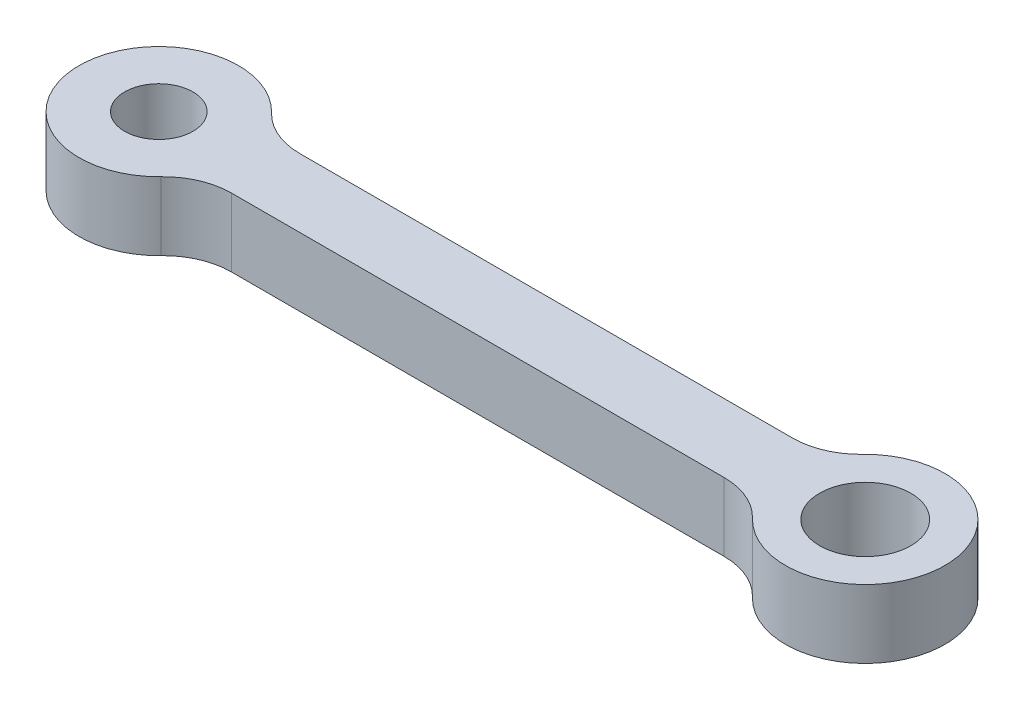
ISO-10303-21;
HEADER;
FILE_DESCRIPTION(('STEP AP214'),'2;1');
FILE_NAME('part.step','',(''),(''),'','','');
FILE_SCHEMA(('AUTOMOTIVE_DESIGN { 1 0 10303 214 1 1 1 1 }'));
ENDSEC;
DATA;
#1=APPLICATION_CONTEXT('core data for automotive mechanical design processes');
#2=APPLICATION_PROTOCOL_DEFINITION('international standard','automotive_design',2000,#1);
#3=PRODUCT_CONTEXT('',#1,'mechanical');
#4=PRODUCT('Part','Part','',(#3));
#5=PRODUCT_RELATED_PRODUCT_CATEGORY('part','',(#4));
#6=PRODUCT_DEFINITION_FORMATION('','',#4);
#7=PRODUCT_DEFINITION_CONTEXT('part definition',#1,'design');
#8=PRODUCT_DEFINITION('design','',#6,#7);
#9=PRODUCT_DEFINITION_SHAPE('','',#8);
#10=(LENGTH_UNIT() NAMED_UNIT(*) SI_UNIT(.MILLI.,.METRE.));
#11=(NAMED_UNIT(*) PLANE_ANGLE_UNIT() SI_UNIT($,.RADIAN.));
#12=(NAMED_UNIT(*) SI_UNIT($,.STERADIAN.) SOLID_ANGLE_UNIT());
#13=UNCERTAINTY_MEASURE_WITH_UNIT(LENGTH_MEASURE(1.E-05),#10,'distance_accuracy_value','');
#14=(GEOMETRIC_REPRESENTATION_CONTEXT(3) GLOBAL_UNCERTAINTY_ASSIGNED_CONTEXT((#13)) GLOBAL_UNIT_ASSIGNED_CONTEXT((#10,
#11,#12)) REPRESENTATION_CONTEXT('',''));
#15=CARTESIAN_POINT('',(0.,0.,0.));
#16=DIRECTION('',(0.,0.,1.));
#17=DIRECTION('',(1.,0.,0.));
#18=AXIS2_PLACEMENT_3D('',#15,#16,#17);
#19=CARTESIAN_POINT('',(31.,3.,0.));
#20=DIRECTION('',(0.,-1.,0.));
#21=DIRECTION('',(0.,0.,-1.));
#22=AXIS2_PLACEMENT_3D('',#19,#20,#21);
#23=CYLINDRICAL_SURFACE('',#22,3.5);
#24=CARTESIAN_POINT('',(31.,3.,0.));
#25=DIRECTION('',(0.,1.,0.));
#26=DIRECTION('',(0.,0.,1.));
#27=AXIS2_PLACEMENT_3D('',#24,#25,#26);
#28=CIRCLE('',#27,3.5);
#29=CARTESIAN_POINT('',(28.4743915139412,3.,2.42307692307692));
#30=VERTEX_POINT('',#29);
#31=CARTESIAN_POINT('',(28.4743915139412,3.,-2.42307692307692));
#32=VERTEX_POINT('',#31);
#33=EDGE_CURVE('E155',#30,#32,#28,.T.);
#34=ORIENTED_EDGE('',*,*,#33,.F.);
#35=DIRECTION('',(0.,-1.,0.));
#36=VECTOR('',#35,1.);
#37=CARTESIAN_POINT('',(28.4743915139412,3.,2.42307692307692));
#38=LINE('',#37,#36);
#39=CARTESIAN_POINT('',(28.4743915139412,0.,2.42307692307692));
#40=VERTEX_POINT('',#39);
#41=EDGE_CURVE('E163',#30,#40,#38,.T.);
#42=ORIENTED_EDGE('',*,*,#41,.T.);
#43=CARTESIAN_POINT('',(31.,0.,0.));
#44=DIRECTION('',(0.,1.,0.));
#45=DIRECTION('',(0.,0.,1.));
#46=AXIS2_PLACEMENT_3D('',#43,#44,#45);
#47=CIRCLE('',#46,3.5);
#48=CARTESIAN_POINT('',(28.4743915139412,0.,-2.42307692307692));
#49=VERTEX_POINT('',#48);
#50=EDGE_CURVE('E180',#40,#49,#47,.T.);
#51=ORIENTED_EDGE('',*,*,#50,.T.);
#52=DIRECTION('',(0.,-1.,0.));
#53=VECTOR('',#52,1.);
#54=CARTESIAN_POINT('',(28.4743915139412,3.,-2.42307692307692));
#55=LINE('',#54,#53);
#56=EDGE_CURVE('E161',#49,#32,#55,.F.);
#57=ORIENTED_EDGE('',*,*,#56,.T.);
#58=EDGE_LOOP('',(#34,#42,#51,#57));
#59=FACE_BOUND('',#58,.T.);
#60=ADVANCED_FACE('F49',(#59),#23,.T.);
#61=CARTESIAN_POINT('',(0.,3.,-1.5));
#62=DIRECTION('',(0.,0.,-1.));
#63=DIRECTION('',(-1.,0.,0.));
#64=AXIS2_PLACEMENT_3D('',#61,#62,#63);
#65=PLANE('',#64);
#66=DIRECTION('',(1.,0.,0.));
#67=VECTOR('',#66,1.);
#68=CARTESIAN_POINT('',(0.,3.,-1.5));
#69=LINE('',#68,#67);
#70=CARTESIAN_POINT('',(4.69041575982343,3.,-1.5));
#71=VERTEX_POINT('',#70);
#72=CARTESIAN_POINT('',(26.3095842401766,3.,-1.5));
#73=VERTEX_POINT('',#72);
#74=EDGE_CURVE('E187',#71,#73,#69,.T.);
#75=ORIENTED_EDGE('',*,*,#74,.T.);
#76=DIRECTION('',(0.,-1.,0.));
#77=VECTOR('',#76,1.);
#78=CARTESIAN_POINT('',(26.3095842401766,3.,-1.5));
#79=LINE('',#78,#77);
#80=CARTESIAN_POINT('',(26.3095842401766,0.,-1.5));
#81=VERTEX_POINT('',#80);
#82=EDGE_CURVE('E126',#73,#81,#79,.T.);
#83=ORIENTED_EDGE('',*,*,#82,.T.);
#84=DIRECTION('',(1.,0.,0.));
#85=VECTOR('',#84,1.);
#86=CARTESIAN_POINT('',(0.,0.,-1.5));
#87=LINE('',#86,#85);
#88=CARTESIAN_POINT('',(4.69041575982343,0.,-1.5));
#89=VERTEX_POINT('',#88);
#90=EDGE_CURVE('E149',#89,#81,#87,.T.);
#91=ORIENTED_EDGE('',*,*,#90,.F.);
#92=DIRECTION('',(0.,-1.,0.));
#93=VECTOR('',#92,1.);
#94=CARTESIAN_POINT('',(4.69041575982343,3.,-1.5));
#95=LINE('',#94,#93);
#96=EDGE_CURVE('E71',#89,#71,#95,.F.);
#97=ORIENTED_EDGE('',*,*,#96,.T.);
#98=EDGE_LOOP('',(#75,#83,#91,#97));
#99=FACE_BOUND('',#98,.T.);
#100=ADVANCED_FACE('F178',(#99),#65,.T.);
#101=CARTESIAN_POINT('',(0.,3.,0.));
#102=DIRECTION('',(0.,-1.,0.));
#103=DIRECTION('',(0.,0.,-1.));
#104=AXIS2_PLACEMENT_3D('',#101,#102,#103);
#105=CYLINDRICAL_SURFACE('',#104,3.5);
#106=CARTESIAN_POINT('',(0.,0.,0.));
#107=DIRECTION('',(0.,1.,0.));
#108=DIRECTION('',(0.,0.,1.));
#109=AXIS2_PLACEMENT_3D('',#106,#107,#108);
#110=CIRCLE('',#109,3.5);
#111=CARTESIAN_POINT('',(2.52560848605877,0.,-2.42307692307692));
#112=VERTEX_POINT('',#111);
#113=CARTESIAN_POINT('',(2.52560848605877,0.,2.42307692307692));
#114=VERTEX_POINT('',#113);
#115=EDGE_CURVE('E144',#112,#114,#110,.T.);
#116=ORIENTED_EDGE('',*,*,#115,.T.);
#117=DIRECTION('',(0.,-1.,0.));
#118=VECTOR('',#117,1.);
#119=CARTESIAN_POINT('',(2.52560848605877,3.,2.42307692307692));
#120=LINE('',#119,#118);
#121=CARTESIAN_POINT('',(2.52560848605877,3.,2.42307692307692));
#122=VERTEX_POINT('',#121);
#123=EDGE_CURVE('E120',#114,#122,#120,.F.);
#124=ORIENTED_EDGE('',*,*,#123,.T.);
#125=CARTESIAN_POINT('',(0.,3.,0.));
#126=DIRECTION('',(0.,1.,0.));
#127=DIRECTION('',(0.,0.,1.));
#128=AXIS2_PLACEMENT_3D('',#125,#126,#127);
#129=CIRCLE('',#128,3.5);
#130=CARTESIAN_POINT('',(2.52560848605877,3.,-2.42307692307692));
#131=VERTEX_POINT('',#130);
#132=EDGE_CURVE('E186',#131,#122,#129,.T.);
#133=ORIENTED_EDGE('',*,*,#132,.F.);
#134=DIRECTION('',(0.,-1.,0.));
#135=VECTOR('',#134,1.);
#136=CARTESIAN_POINT('',(2.52560848605877,3.,-2.42307692307692));
#137=LINE('',#136,#135);
#138=EDGE_CURVE('E136',#131,#112,#137,.T.);
#139=ORIENTED_EDGE('',*,*,#138,.T.);
#140=EDGE_LOOP('',(#116,#124,#133,#139));
#141=FACE_BOUND('',#140,.T.);
#142=ADVANCED_FACE('F189',(#141),#105,.T.);
#143=CARTESIAN_POINT('',(0.,3.,0.));
#144=DIRECTION('',(0.,-1.,0.));
#145=DIRECTION('',(0.,0.,-1.));
#146=AXIS2_PLACEMENT_3D('',#143,#144,#145);
#147=CYLINDRICAL_SURFACE('',#146,1.5);
#148=CARTESIAN_POINT('',(0.,3.,0.));
#149=DIRECTION('',(0.,1.,0.));
#150=DIRECTION('',(0.,0.,1.));
#151=AXIS2_PLACEMENT_3D('',#148,#149,#150);
#152=CIRCLE('',#151,1.5);
#153=CARTESIAN_POINT('',(0.,3.,1.5));
#154=VERTEX_POINT('',#153);
#155=EDGE_CURVE('E191',#154,#154,#152,.T.);
#156=ORIENTED_EDGE('',*,*,#155,.T.);
#157=EDGE_LOOP('',(#156));
#158=FACE_BOUND('',#157,.T.);
#159=CARTESIAN_POINT('',(0.,0.,0.));
#160=DIRECTION('',(0.,1.,0.));
#161=DIRECTION('',(0.,0.,1.));
#162=AXIS2_PLACEMENT_3D('',#159,#160,#161);
#163=CIRCLE('',#162,1.5);
#164=CARTESIAN_POINT('',(0.,0.,1.5));
#165=VERTEX_POINT('',#164);
#166=EDGE_CURVE('E143',#165,#165,#163,.T.);
#167=ORIENTED_EDGE('',*,*,#166,.F.);
#168=EDGE_LOOP('',(#167));
#169=FACE_BOUND('',#168,.T.);
#170=ADVANCED_FACE('F238',(#158,#169),#147,.F.);
#171=CARTESIAN_POINT('',(0.,3.,1.5));
#172=DIRECTION('',(0.,0.,-1.));
#173=DIRECTION('',(-1.,0.,0.));
#174=AXIS2_PLACEMENT_3D('',#171,#172,#173);
#175=PLANE('',#174);
#176=DIRECTION('',(1.,0.,0.));
#177=VECTOR('',#176,1.);
#178=CARTESIAN_POINT('',(0.,3.,1.5));
#179=LINE('',#178,#177);
#180=CARTESIAN_POINT('',(4.69041575982343,3.,1.5));
#181=VERTEX_POINT('',#180);
#182=CARTESIAN_POINT('',(26.3095842401766,3.,1.5));
#183=VERTEX_POINT('',#182);
#184=EDGE_CURVE('E135',#181,#183,#179,.T.);
#185=ORIENTED_EDGE('',*,*,#184,.F.);
#186=DIRECTION('',(0.,1.,0.));
#187=VECTOR('',#186,1.);
#188=CARTESIAN_POINT('',(4.69041575982343,0.,1.5));
#189=LINE('',#188,#187);
#190=CARTESIAN_POINT('',(4.69041575982343,0.,1.5));
#191=VERTEX_POINT('',#190);
#192=EDGE_CURVE('E119',#181,#191,#189,.F.);
#193=ORIENTED_EDGE('',*,*,#192,.T.);
#194=DIRECTION('',(1.,0.,0.));
#195=VECTOR('',#194,1.);
#196=CARTESIAN_POINT('',(0.,0.,1.5));
#197=LINE('',#196,#195);
#198=CARTESIAN_POINT('',(26.3095842401766,0.,1.5));
#199=VERTEX_POINT('',#198);
#200=EDGE_CURVE('E132',#191,#199,#197,.T.);
#201=ORIENTED_EDGE('',*,*,#200,.T.);
#202=DIRECTION('',(0.,1.,0.));
#203=VECTOR('',#202,1.);
#204=CARTESIAN_POINT('',(26.3095842401766,3.,1.5));
#205=LINE('',#204,#203);
#206=EDGE_CURVE('E137',#199,#183,#205,.T.);
#207=ORIENTED_EDGE('',*,*,#206,.T.);
#208=EDGE_LOOP('',(#185,#193,#201,#207));
#209=FACE_BOUND('',#208,.T.);
#210=ADVANCED_FACE('F131',(#209),#175,.F.);
#211=CARTESIAN_POINT('',(31.,3.,0.));
#212=DIRECTION('',(0.,-1.,0.));
#213=DIRECTION('',(0.,0.,-1.));
#214=AXIS2_PLACEMENT_3D('',#211,#212,#213);
#215=CYLINDRICAL_SURFACE('',#214,2.);
#216=CARTESIAN_POINT('',(31.,3.,0.));
#217=DIRECTION('',(0.,1.,0.));
#218=DIRECTION('',(0.,0.,1.));
#219=AXIS2_PLACEMENT_3D('',#216,#217,#218);
#220=CIRCLE('',#219,2.);
#221=CARTESIAN_POINT('',(31.,3.,2.));
#222=VERTEX_POINT('',#221);
#223=EDGE_CURVE('E156',#222,#222,#220,.T.);
#224=ORIENTED_EDGE('',*,*,#223,.T.);
#225=EDGE_LOOP('',(#224));
#226=FACE_BOUND('',#225,.T.);
#227=CARTESIAN_POINT('',(31.,0.,0.));
#228=DIRECTION('',(0.,1.,0.));
#229=DIRECTION('',(0.,0.,1.));
#230=AXIS2_PLACEMENT_3D('',#227,#228,#229);
#231=CIRCLE('',#230,2.);
#232=CARTESIAN_POINT('',(31.,0.,2.));
#233=VERTEX_POINT('',#232);
#234=EDGE_CURVE('E147',#233,#233,#231,.T.);
#235=ORIENTED_EDGE('',*,*,#234,.F.);
#236=EDGE_LOOP('',(#235));
#237=FACE_BOUND('',#236,.T.);
#238=ADVANCED_FACE('F232',(#226,#237),#215,.F.);
#239=CARTESIAN_POINT('',(0.,3.,0.));
#240=DIRECTION('',(0.,1.,0.));
#241=DIRECTION('',(0.,0.,1.));
#242=AXIS2_PLACEMENT_3D('',#239,#240,#241);
#243=PLANE('',#242);
#244=ORIENTED_EDGE('',*,*,#184,.T.);
#245=CARTESIAN_POINT('',(26.3095842401766,3.,4.5));
#246=DIRECTION('',(0.,1.,0.));
#247=DIRECTION('',(0.,0.,1.));
#248=AXIS2_PLACEMENT_3D('',#245,#246,#247);
#249=CIRCLE('',#248,3.);
#250=EDGE_CURVE('E171',#183,#30,#249,.F.);
#251=ORIENTED_EDGE('',*,*,#250,.T.);
#252=ORIENTED_EDGE('',*,*,#33,.T.);
#253=CARTESIAN_POINT('',(26.3095842401766,3.,-4.5));
#254=DIRECTION('',(0.,1.,0.));
#255=DIRECTION('',(0.,0.,1.));
#256=AXIS2_PLACEMENT_3D('',#253,#254,#255);
#257=CIRCLE('',#256,3.);
#258=EDGE_CURVE('E64',#32,#73,#257,.F.);
#259=ORIENTED_EDGE('',*,*,#258,.T.);
#260=ORIENTED_EDGE('',*,*,#74,.F.);
#261=CARTESIAN_POINT('',(4.69041575982343,3.,-4.5));
#262=DIRECTION('',(0.,1.,0.));
#263=DIRECTION('',(0.,0.,1.));
#264=AXIS2_PLACEMENT_3D('',#261,#262,#263);
#265=CIRCLE('',#264,3.);
#266=EDGE_CURVE('E11',#71,#131,#265,.F.);
#267=ORIENTED_EDGE('',*,*,#266,.T.);
#268=ORIENTED_EDGE('',*,*,#132,.T.);
#269=CARTESIAN_POINT('',(4.69041575982343,3.,4.5));
#270=DIRECTION('',(0.,1.,0.));
#271=DIRECTION('',(0.,0.,1.));
#272=AXIS2_PLACEMENT_3D('',#269,#270,#271);
#273=CIRCLE('',#272,3.);
#274=EDGE_CURVE('E125',#122,#181,#273,.F.);
#275=ORIENTED_EDGE('',*,*,#274,.T.);
#276=EDGE_LOOP('',(#244,#251,#252,#259,#260,#267,#268,#275));
#277=FACE_BOUND('',#276,.T.);
#278=ORIENTED_EDGE('',*,*,#155,.F.);
#279=EDGE_LOOP('',(#278));
#280=FACE_BOUND('',#279,.T.);
#281=ORIENTED_EDGE('',*,*,#223,.F.);
#282=EDGE_LOOP('',(#281));
#283=FACE_BOUND('',#282,.T.);
#284=ADVANCED_FACE('F184',(#277,#280,#283),#243,.T.);
#285=CARTESIAN_POINT('',(0.,0.,0.));
#286=DIRECTION('',(0.,1.,0.));
#287=DIRECTION('',(0.,0.,1.));
#288=AXIS2_PLACEMENT_3D('',#285,#286,#287);
#289=PLANE('',#288);
#290=ORIENTED_EDGE('',*,*,#50,.F.);
#291=CARTESIAN_POINT('',(26.3095842401766,0.,4.5));
#292=DIRECTION('',(0.,1.,0.));
#293=DIRECTION('',(0.,0.,1.));
#294=AXIS2_PLACEMENT_3D('',#291,#292,#293);
#295=CIRCLE('',#294,3.);
#296=EDGE_CURVE('E142',#40,#199,#295,.T.);
#297=ORIENTED_EDGE('',*,*,#296,.T.);
#298=ORIENTED_EDGE('',*,*,#200,.F.);
#299=CARTESIAN_POINT('',(4.69041575982343,0.,4.5));
#300=DIRECTION('',(0.,1.,0.));
#301=DIRECTION('',(0.,0.,1.));
#302=AXIS2_PLACEMENT_3D('',#299,#300,#301);
#303=CIRCLE('',#302,3.);
#304=EDGE_CURVE('E115',#191,#114,#303,.T.);
#305=ORIENTED_EDGE('',*,*,#304,.T.);
#306=ORIENTED_EDGE('',*,*,#115,.F.);
#307=CARTESIAN_POINT('',(4.69041575982343,0.,-4.5));
#308=DIRECTION('',(0.,1.,0.));
#309=DIRECTION('',(0.,0.,1.));
#310=AXIS2_PLACEMENT_3D('',#307,#308,#309);
#311=CIRCLE('',#310,3.);
#312=EDGE_CURVE('E57',#112,#89,#311,.T.);
#313=ORIENTED_EDGE('',*,*,#312,.T.);
#314=ORIENTED_EDGE('',*,*,#90,.T.);
#315=CARTESIAN_POINT('',(26.3095842401766,0.,-4.5));
#316=DIRECTION('',(0.,1.,0.));
#317=DIRECTION('',(0.,0.,1.));
#318=AXIS2_PLACEMENT_3D('',#315,#316,#317);
#319=CIRCLE('',#318,3.);
#320=EDGE_CURVE('E173',#81,#49,#319,.T.);
#321=ORIENTED_EDGE('',*,*,#320,.T.);
#322=EDGE_LOOP('',(#290,#297,#298,#305,#306,#313,#314,#321));
#323=FACE_BOUND('',#322,.T.);
#324=ORIENTED_EDGE('',*,*,#166,.T.);
#325=EDGE_LOOP('',(#324));
#326=FACE_BOUND('',#325,.T.);
#327=ORIENTED_EDGE('',*,*,#234,.T.);
#328=EDGE_LOOP('',(#327));
#329=FACE_BOUND('',#328,.T.);
#330=ADVANCED_FACE('F140',(#323,#326,#329),#289,.F.);
#331=CARTESIAN_POINT('',(4.69041575982343,3.,4.5));
#332=DIRECTION('',(0.,-1.,0.));
#333=DIRECTION('',(0.,0.,-1.));
#334=AXIS2_PLACEMENT_3D('',#331,#332,#333);
#335=CYLINDRICAL_SURFACE('',#334,3.);
#336=ORIENTED_EDGE('',*,*,#274,.F.);
#337=ORIENTED_EDGE('',*,*,#123,.F.);
#338=ORIENTED_EDGE('',*,*,#304,.F.);
#339=ORIENTED_EDGE('',*,*,#192,.F.);
#340=EDGE_LOOP('',(#336,#337,#338,#339));
#341=FACE_BOUND('',#340,.T.);
#342=ADVANCED_FACE('F118',(#341),#335,.F.);
#343=CARTESIAN_POINT('',(26.3095842401766,3.,4.5));
#344=DIRECTION('',(0.,-1.,0.));
#345=DIRECTION('',(0.,0.,-1.));
#346=AXIS2_PLACEMENT_3D('',#343,#344,#345);
#347=CYLINDRICAL_SURFACE('',#346,3.);
#348=ORIENTED_EDGE('',*,*,#250,.F.);
#349=ORIENTED_EDGE('',*,*,#206,.F.);
#350=ORIENTED_EDGE('',*,*,#296,.F.);
#351=ORIENTED_EDGE('',*,*,#41,.F.);
#352=EDGE_LOOP('',(#348,#349,#350,#351));
#353=FACE_BOUND('',#352,.T.);
#354=ADVANCED_FACE('F208',(#353),#347,.F.);
#355=CARTESIAN_POINT('',(26.3095842401766,3.,-4.5));
#356=DIRECTION('',(0.,-1.,0.));
#357=DIRECTION('',(0.,0.,-1.));
#358=AXIS2_PLACEMENT_3D('',#355,#356,#357);
#359=CYLINDRICAL_SURFACE('',#358,3.);
#360=ORIENTED_EDGE('',*,*,#258,.F.);
#361=ORIENTED_EDGE('',*,*,#56,.F.);
#362=ORIENTED_EDGE('',*,*,#320,.F.);
#363=ORIENTED_EDGE('',*,*,#82,.F.);
#364=EDGE_LOOP('',(#360,#361,#362,#363));
#365=FACE_BOUND('',#364,.T.);
#366=ADVANCED_FACE('F206',(#365),#359,.F.);
#367=CARTESIAN_POINT('',(4.69041575982343,3.,-4.5));
#368=DIRECTION('',(0.,-1.,0.));
#369=DIRECTION('',(0.,0.,-1.));
#370=AXIS2_PLACEMENT_3D('',#367,#368,#369);
#371=CYLINDRICAL_SURFACE('',#370,3.);
#372=ORIENTED_EDGE('',*,*,#266,.F.);
#373=ORIENTED_EDGE('',*,*,#96,.F.);
#374=ORIENTED_EDGE('',*,*,#312,.F.);
#375=ORIENTED_EDGE('',*,*,#138,.F.);
#376=EDGE_LOOP('',(#372,#373,#374,#375));
#377=FACE_BOUND('',#376,.T.);
#378=ADVANCED_FACE('F51',(#377),#371,.F.);
#379=CLOSED_SHELL('',(#60,#100,#142,#170,#210,#238,#284,#330,#342,#354,#366,#378));
#380=MANIFOLD_SOLID_BREP('B2',#379);
#381=ADVANCED_BREP_SHAPE_REPRESENTATION('',(#18,#380),#14);
#382=SHAPE_DEFINITION_REPRESENTATION(#9,#381);
ENDSEC;
END-ISO-10303-21;
